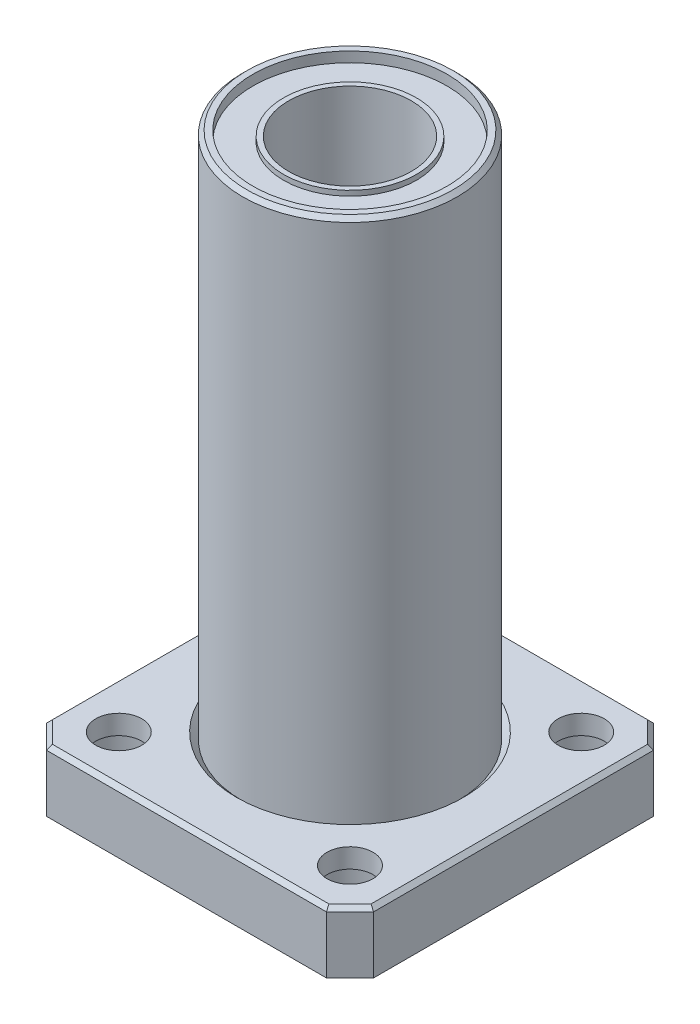
ISO-10303-21;
HEADER;
FILE_DESCRIPTION(('STEP AP214'),'2;1');
FILE_NAME('part.step','',(''),(''),'','','');
FILE_SCHEMA(('AUTOMOTIVE_DESIGN { 1 0 10303 214 1 1 1 1 }'));
ENDSEC;
DATA;
#1=APPLICATION_CONTEXT('core data for automotive mechanical design processes');
#2=APPLICATION_PROTOCOL_DEFINITION('international standard','automotive_design',2000,#1);
#3=PRODUCT_CONTEXT('',#1,'mechanical');
#4=PRODUCT('Part','Part','',(#3));
#5=PRODUCT_RELATED_PRODUCT_CATEGORY('part','',(#4));
#6=PRODUCT_DEFINITION_FORMATION('','',#4);
#7=PRODUCT_DEFINITION_CONTEXT('part definition',#1,'design');
#8=PRODUCT_DEFINITION('design','',#6,#7);
#9=PRODUCT_DEFINITION_SHAPE('','',#8);
#10=(LENGTH_UNIT() NAMED_UNIT(*) SI_UNIT(.MILLI.,.METRE.));
#11=(NAMED_UNIT(*) PLANE_ANGLE_UNIT() SI_UNIT($,.RADIAN.));
#12=(NAMED_UNIT(*) SI_UNIT($,.STERADIAN.) SOLID_ANGLE_UNIT());
#13=UNCERTAINTY_MEASURE_WITH_UNIT(LENGTH_MEASURE(1.E-05),#10,'distance_accuracy_value','');
#14=(GEOMETRIC_REPRESENTATION_CONTEXT(3) GLOBAL_UNCERTAINTY_ASSIGNED_CONTEXT((#13)) GLOBAL_UNIT_ASSIGNED_CONTEXT((#10,
#11,#12)) REPRESENTATION_CONTEXT('',''));
#15=CARTESIAN_POINT('',(0.,0.,0.));
#16=DIRECTION('',(0.,0.,1.));
#17=DIRECTION('',(1.,0.,0.));
#18=AXIS2_PLACEMENT_3D('',#15,#16,#17);
#19=CARTESIAN_POINT('',(11.3137084989848,4.1,-11.3137084989848));
#20=DIRECTION('',(0.,-1.,0.));
#21=DIRECTION('',(0.,0.,-1.));
#22=AXIS2_PLACEMENT_3D('',#19,#20,#21);
#23=CYLINDRICAL_SURFACE('',#22,3.75);
#24=CARTESIAN_POINT('',(11.3137084989848,0.,-11.3137084989848));
#25=DIRECTION('',(0.,-1.,0.));
#26=DIRECTION('',(0.,0.,-1.));
#27=AXIS2_PLACEMENT_3D('',#24,#25,#26);
#28=CIRCLE('',#27,3.75);
#29=CARTESIAN_POINT('',(11.3137084989848,0.,-15.0637084989848));
#30=VERTEX_POINT('',#29);
#31=EDGE_CURVE('P0_E19',#30,#30,#28,.T.);
#32=ORIENTED_EDGE('',*,*,#31,.T.);
#33=EDGE_LOOP('',(#32));
#34=FACE_BOUND('',#33,.T.);
#35=CARTESIAN_POINT('',(11.3137084989848,3.69999999998072,-11.3137084989848));
#36=DIRECTION('',(0.,-1.,0.));
#37=DIRECTION('',(0.,0.,1.));
#38=AXIS2_PLACEMENT_3D('',#35,#36,#37);
#39=CIRCLE('',#38,3.74999999993583);
#40=CARTESIAN_POINT('',(11.3137084989848,3.69999999998072,-7.56370849904897));
#41=VERTEX_POINT('',#40);
#42=EDGE_CURVE('P0_E133',#41,#41,#39,.F.);
#43=ORIENTED_EDGE('',*,*,#42,.T.);
#44=EDGE_LOOP('',(#43));
#45=FACE_BOUND('',#44,.T.);
#46=ADVANCED_FACE('P0_F16',(#34,#45),#23,.F.);
#47=CARTESIAN_POINT('',(0.,0.,0.));
#48=DIRECTION('',(0.,1.,0.));
#49=DIRECTION('',(0.,0.,1.));
#50=AXIS2_PLACEMENT_3D('',#47,#48,#49);
#51=PLANE('',#50);
#52=CARTESIAN_POINT('',(0.,0.,0.));
#53=DIRECTION('',(0.,-1.,0.));
#54=DIRECTION('',(0.,0.,-1.));
#55=AXIS2_PLACEMENT_3D('',#52,#53,#54);
#56=CIRCLE('',#55,10.9);
#57=CARTESIAN_POINT('',(0.,0.,-10.9));
#58=VERTEX_POINT('',#57);
#59=EDGE_CURVE('P0_E183',#58,#58,#56,.F.);
#60=ORIENTED_EDGE('',*,*,#59,.T.);
#61=EDGE_LOOP('',(#60));
#62=FACE_BOUND('',#61,.T.);
#63=CARTESIAN_POINT('',(-11.3137084989848,0.,-11.3137084989848));
#64=DIRECTION('',(0.,-1.,0.));
#65=DIRECTION('',(0.,0.,-1.));
#66=AXIS2_PLACEMENT_3D('',#63,#64,#65);
#67=CIRCLE('',#66,3.75);
#68=CARTESIAN_POINT('',(-11.3137084989848,0.,-15.0637084989848));
#69=VERTEX_POINT('',#68);
#70=EDGE_CURVE('P0_E181',#69,#69,#67,.F.);
#71=ORIENTED_EDGE('',*,*,#70,.T.);
#72=EDGE_LOOP('',(#71));
#73=FACE_BOUND('',#72,.T.);
#74=ORIENTED_EDGE('',*,*,#31,.F.);
#75=EDGE_LOOP('',(#74));
#76=FACE_BOUND('',#75,.T.);
#77=CARTESIAN_POINT('',(11.3137084989848,0.,11.3137084989848));
#78=DIRECTION('',(0.,-1.,0.));
#79=DIRECTION('',(0.,0.,-1.));
#80=AXIS2_PLACEMENT_3D('',#77,#78,#79);
#81=CIRCLE('',#80,3.75);
#82=CARTESIAN_POINT('',(11.3137084989848,0.,7.5637084989848));
#83=VERTEX_POINT('',#82);
#84=EDGE_CURVE('P0_E135',#83,#83,#81,.F.);
#85=ORIENTED_EDGE('',*,*,#84,.T.);
#86=EDGE_LOOP('',(#85));
#87=FACE_BOUND('',#86,.T.);
#88=CARTESIAN_POINT('',(-11.3137084989848,0.,11.3137084989848));
#89=DIRECTION('',(0.,-1.,0.));
#90=DIRECTION('',(0.,0.,-1.));
#91=AXIS2_PLACEMENT_3D('',#88,#89,#90);
#92=CIRCLE('',#91,3.75);
#93=CARTESIAN_POINT('',(-11.3137084989848,0.,7.5637084989848));
#94=VERTEX_POINT('',#93);
#95=EDGE_CURVE('P0_E121',#94,#94,#92,.F.);
#96=ORIENTED_EDGE('',*,*,#95,.T.);
#97=EDGE_LOOP('',(#96));
#98=FACE_BOUND('',#97,.T.);
#99=DIRECTION('',(-0.707106781186548,0.,0.707106781186548));
#100=VECTOR('',#99,1.);
#101=CARTESIAN_POINT('',(29.698484809835,0.,0.));
#102=LINE('',#101,#100);
#103=CARTESIAN_POINT('',(16.,0.,13.698484809835));
#104=VERTEX_POINT('',#103);
#105=CARTESIAN_POINT('',(13.698484809835,0.,16.));
#106=VERTEX_POINT('',#105);
#107=EDGE_CURVE('P0_E108',#104,#106,#102,.T.);
#108=ORIENTED_EDGE('',*,*,#107,.T.);
#109=DIRECTION('',(-1.,0.,0.));
#110=VECTOR('',#109,1.);
#111=CARTESIAN_POINT('',(-16.,0.,16.));
#112=LINE('',#111,#110);
#113=CARTESIAN_POINT('',(-13.698484809835,0.,16.));
#114=VERTEX_POINT('',#113);
#115=EDGE_CURVE('P0_E308',#106,#114,#112,.T.);
#116=ORIENTED_EDGE('',*,*,#115,.T.);
#117=DIRECTION('',(-0.707106781186547,0.,-0.707106781186548));
#118=VECTOR('',#117,1.);
#119=CARTESIAN_POINT('',(0.,0.,29.698484809835));
#120=LINE('',#119,#118);
#121=CARTESIAN_POINT('',(-16.,0.,13.698484809835));
#122=VERTEX_POINT('',#121);
#123=EDGE_CURVE('P0_E313',#114,#122,#120,.T.);
#124=ORIENTED_EDGE('',*,*,#123,.T.);
#125=DIRECTION('',(0.,0.,-1.));
#126=VECTOR('',#125,1.);
#127=CARTESIAN_POINT('',(-16.,0.,-16.));
#128=LINE('',#127,#126);
#129=CARTESIAN_POINT('',(-16.,0.,-13.698484809835));
#130=VERTEX_POINT('',#129);
#131=EDGE_CURVE('P0_E317',#122,#130,#128,.T.);
#132=ORIENTED_EDGE('',*,*,#131,.T.);
#133=DIRECTION('',(0.707106781186548,0.,-0.707106781186547));
#134=VECTOR('',#133,1.);
#135=CARTESIAN_POINT('',(0.,0.,-29.698484809835));
#136=LINE('',#135,#134);
#137=CARTESIAN_POINT('',(-13.698484809835,0.,-16.));
#138=VERTEX_POINT('',#137);
#139=EDGE_CURVE('P0_E321',#130,#138,#136,.T.);
#140=ORIENTED_EDGE('',*,*,#139,.T.);
#141=DIRECTION('',(1.,0.,0.));
#142=VECTOR('',#141,1.);
#143=CARTESIAN_POINT('',(-16.,0.,-16.));
#144=LINE('',#143,#142);
#145=CARTESIAN_POINT('',(13.698484809835,0.,-16.));
#146=VERTEX_POINT('',#145);
#147=EDGE_CURVE('P0_E324',#138,#146,#144,.T.);
#148=ORIENTED_EDGE('',*,*,#147,.T.);
#149=DIRECTION('',(0.707106781186547,0.,0.707106781186548));
#150=VECTOR('',#149,1.);
#151=CARTESIAN_POINT('',(29.698484809835,0.,0.));
#152=LINE('',#151,#150);
#153=CARTESIAN_POINT('',(16.,0.,-13.698484809835));
#154=VERTEX_POINT('',#153);
#155=EDGE_CURVE('P0_E103',#146,#154,#152,.T.);
#156=ORIENTED_EDGE('',*,*,#155,.T.);
#157=DIRECTION('',(0.,0.,1.));
#158=VECTOR('',#157,1.);
#159=CARTESIAN_POINT('',(16.,0.,-16.));
#160=LINE('',#159,#158);
#161=EDGE_CURVE('P0_E105',#154,#104,#160,.T.);
#162=ORIENTED_EDGE('',*,*,#161,.T.);
#163=EDGE_LOOP('',(#108,#116,#124,#132,#140,#148,#156,#162));
#164=FACE_BOUND('',#163,.T.);
#165=ADVANCED_FACE('P0_F107',(#62,#73,#76,#87,#98,#164),#51,.F.);
#166=CARTESIAN_POINT('',(0.,0.,0.));
#167=DIRECTION('',(0.,-1.,0.));
#168=DIRECTION('',(0.,0.,-1.));
#169=AXIS2_PLACEMENT_3D('',#166,#167,#168);
#170=CONICAL_SURFACE('',#169,10.9,0.785398163397449);
#171=CARTESIAN_POINT('',(0.,0.399999999999998,0.));
#172=DIRECTION('',(0.,-1.,0.));
#173=DIRECTION('',(0.,0.,-1.));
#174=AXIS2_PLACEMENT_3D('',#171,#172,#173);
#175=CIRCLE('',#174,10.5);
#176=CARTESIAN_POINT('',(0.,0.399999999999998,-10.5));
#177=VERTEX_POINT('',#176);
#178=EDGE_CURVE('P0_E176',#177,#177,#175,.F.);
#179=ORIENTED_EDGE('',*,*,#178,.T.);
#180=EDGE_LOOP('',(#179));
#181=FACE_BOUND('',#180,.T.);
#182=ORIENTED_EDGE('',*,*,#59,.F.);
#183=EDGE_LOOP('',(#182));
#184=FACE_BOUND('',#183,.T.);
#185=ADVANCED_FACE('P0_F194',(#181,#184),#170,.F.);
#186=CARTESIAN_POINT('',(-11.3137084989848,4.1,-11.3137084989848));
#187=DIRECTION('',(0.,-1.,0.));
#188=DIRECTION('',(0.,0.,-1.));
#189=AXIS2_PLACEMENT_3D('',#186,#187,#188);
#190=CYLINDRICAL_SURFACE('',#189,3.75);
#191=ORIENTED_EDGE('',*,*,#70,.F.);
#192=EDGE_LOOP('',(#191));
#193=FACE_BOUND('',#192,.T.);
#194=CARTESIAN_POINT('',(-11.3137084989848,4.1,-11.3137084989848));
#195=DIRECTION('',(0.,-1.,0.));
#196=DIRECTION('',(0.,0.,-1.));
#197=AXIS2_PLACEMENT_3D('',#194,#195,#196);
#198=CIRCLE('',#197,3.75);
#199=CARTESIAN_POINT('',(-11.3137084989848,4.1,-15.0637084989848));
#200=VERTEX_POINT('',#199);
#201=EDGE_CURVE('P0_E173',#200,#200,#198,.T.);
#202=ORIENTED_EDGE('',*,*,#201,.F.);
#203=EDGE_LOOP('',(#202));
#204=FACE_BOUND('',#203,.T.);
#205=ADVANCED_FACE('P0_F421',(#193,#204),#190,.F.);
#206=CARTESIAN_POINT('',(11.3137084989848,4.1,11.3137084989848));
#207=DIRECTION('',(0.,-1.,0.));
#208=DIRECTION('',(0.,0.,-1.));
#209=AXIS2_PLACEMENT_3D('',#206,#207,#208);
#210=CYLINDRICAL_SURFACE('',#209,3.75);
#211=ORIENTED_EDGE('',*,*,#84,.F.);
#212=EDGE_LOOP('',(#211));
#213=FACE_BOUND('',#212,.T.);
#214=CARTESIAN_POINT('',(11.3137084989848,4.1,11.3137084989848));
#215=DIRECTION('',(0.,-1.,0.));
#216=DIRECTION('',(0.,0.,-1.));
#217=AXIS2_PLACEMENT_3D('',#214,#215,#216);
#218=CIRCLE('',#217,3.75);
#219=CARTESIAN_POINT('',(11.3137084989848,4.1,7.5637084989848));
#220=VERTEX_POINT('',#219);
#221=EDGE_CURVE('P0_E170',#220,#220,#218,.T.);
#222=ORIENTED_EDGE('',*,*,#221,.F.);
#223=EDGE_LOOP('',(#222));
#224=FACE_BOUND('',#223,.T.);
#225=ADVANCED_FACE('P0_F417',(#213,#224),#210,.F.);
#226=CARTESIAN_POINT('',(11.3137084989848,3.70000000003756,-11.3137084989848));
#227=DIRECTION('',(0.,-1.,0.));
#228=DIRECTION('',(0.,0.,-1.));
#229=AXIS2_PLACEMENT_3D('',#226,#227,#228);
#230=CONICAL_SURFACE('',#229,3.74999999987899,0.785398163397448);
#231=ORIENTED_EDGE('',*,*,#42,.F.);
#232=EDGE_LOOP('',(#231));
#233=FACE_BOUND('',#232,.T.);
#234=CARTESIAN_POINT('',(11.3137084989848,4.099999999994,-11.3137084989848));
#235=DIRECTION('',(0.,-1.,0.));
#236=DIRECTION('',(0.,0.,-1.));
#237=AXIS2_PLACEMENT_3D('',#234,#235,#236);
#238=CIRCLE('',#237,3.34999999992255);
#239=CARTESIAN_POINT('',(11.3137084989848,4.099999999994,-14.6637084989074));
#240=VERTEX_POINT('',#239);
#241=EDGE_CURVE('P0_E167',#240,#240,#238,.T.);
#242=ORIENTED_EDGE('',*,*,#241,.F.);
#243=EDGE_LOOP('',(#242));
#244=FACE_BOUND('',#243,.T.);
#245=ADVANCED_FACE('P0_F202',(#233,#244),#230,.F.);
#246=CARTESIAN_POINT('',(-11.3137084989848,4.1,11.3137084989848));
#247=DIRECTION('',(0.,-1.,0.));
#248=DIRECTION('',(0.,0.,-1.));
#249=AXIS2_PLACEMENT_3D('',#246,#247,#248);
#250=CYLINDRICAL_SURFACE('',#249,3.75);
#251=ORIENTED_EDGE('',*,*,#95,.F.);
#252=EDGE_LOOP('',(#251));
#253=FACE_BOUND('',#252,.T.);
#254=CARTESIAN_POINT('',(-11.3137084989848,4.1,11.3137084989848));
#255=DIRECTION('',(0.,-1.,0.));
#256=DIRECTION('',(0.,0.,-1.));
#257=AXIS2_PLACEMENT_3D('',#254,#255,#256);
#258=CIRCLE('',#257,3.75);
#259=CARTESIAN_POINT('',(-11.3137084989848,4.1,7.5637084989848));
#260=VERTEX_POINT('',#259);
#261=EDGE_CURVE('P0_E163',#260,#260,#258,.T.);
#262=ORIENTED_EDGE('',*,*,#261,.F.);
#263=EDGE_LOOP('',(#262));
#264=FACE_BOUND('',#263,.T.);
#265=ADVANCED_FACE('P0_F199',(#253,#264),#250,.F.);
#266=CARTESIAN_POINT('',(29.698484809835,57.,0.));
#267=DIRECTION('',(-0.707106781186548,0.,-0.707106781186548));
#268=DIRECTION('',(-0.707106781186548,0.,0.707106781186548));
#269=AXIS2_PLACEMENT_3D('',#266,#267,#268);
#270=PLANE('',#269);
#271=DIRECTION('',(0.,1.,0.));
#272=VECTOR('',#271,1.);
#273=CARTESIAN_POINT('',(13.698484809835,6.,16.));
#274=LINE('',#273,#272);
#275=CARTESIAN_POINT('',(13.698484809835,5.59999999999998,16.));
#276=VERTEX_POINT('',#275);
#277=EDGE_CURVE('P0_E119',#276,#106,#274,.F.);
#278=ORIENTED_EDGE('',*,*,#277,.T.);
#279=ORIENTED_EDGE('',*,*,#107,.F.);
#280=DIRECTION('',(0.,1.,0.));
#281=VECTOR('',#280,1.);
#282=CARTESIAN_POINT('',(16.,6.,13.698484809835));
#283=LINE('',#282,#281);
#284=CARTESIAN_POINT('',(16.,5.59999999999998,13.698484809835));
#285=VERTEX_POINT('',#284);
#286=EDGE_CURVE('P0_E113',#104,#285,#283,.T.);
#287=ORIENTED_EDGE('',*,*,#286,.T.);
#288=DIRECTION('',(0.707106781186548,0.,-0.707106781186548));
#289=VECTOR('',#288,1.);
#290=CARTESIAN_POINT('',(13.698484809835,5.59999999999999,16.));
#291=LINE('',#290,#289);
#292=EDGE_CURVE('P0_E166',#276,#285,#291,.T.);
#293=ORIENTED_EDGE('',*,*,#292,.F.);
#294=EDGE_LOOP('',(#278,#279,#287,#293));
#295=FACE_BOUND('',#294,.T.);
#296=ADVANCED_FACE('P0_F116',(#295),#270,.F.);
#297=CARTESIAN_POINT('',(16.,6.,-16.));
#298=DIRECTION('',(-1.,0.,0.));
#299=DIRECTION('',(0.,0.,1.));
#300=AXIS2_PLACEMENT_3D('',#297,#298,#299);
#301=PLANE('',#300);
#302=ORIENTED_EDGE('',*,*,#286,.F.);
#303=ORIENTED_EDGE('',*,*,#161,.F.);
#304=DIRECTION('',(0.,1.,0.));
#305=VECTOR('',#304,1.);
#306=CARTESIAN_POINT('',(16.,57.,-13.698484809835));
#307=LINE('',#306,#305);
#308=CARTESIAN_POINT('',(16.,5.6,-13.698484809835));
#309=VERTEX_POINT('',#308);
#310=EDGE_CURVE('P0_E129',#154,#309,#307,.T.);
#311=ORIENTED_EDGE('',*,*,#310,.T.);
#312=DIRECTION('',(0.,0.,1.));
#313=VECTOR('',#312,1.);
#314=CARTESIAN_POINT('',(16.,5.6,-8.));
#315=LINE('',#314,#313);
#316=EDGE_CURVE('P0_E126',#285,#309,#315,.F.);
#317=ORIENTED_EDGE('',*,*,#316,.F.);
#318=EDGE_LOOP('',(#302,#303,#311,#317));
#319=FACE_BOUND('',#318,.T.);
#320=ADVANCED_FACE('P0_F124',(#319),#301,.F.);
#321=CARTESIAN_POINT('',(29.698484809835,57.,0.));
#322=DIRECTION('',(-0.707106781186548,0.,0.707106781186547));
#323=DIRECTION('',(0.707106781186547,0.,0.707106781186548));
#324=AXIS2_PLACEMENT_3D('',#321,#322,#323);
#325=PLANE('',#324);
#326=ORIENTED_EDGE('',*,*,#310,.F.);
#327=ORIENTED_EDGE('',*,*,#155,.F.);
#328=DIRECTION('',(0.,1.,0.));
#329=VECTOR('',#328,1.);
#330=CARTESIAN_POINT('',(13.698484809835,6.,-16.));
#331=LINE('',#330,#329);
#332=CARTESIAN_POINT('',(13.698484809835,5.6,-16.));
#333=VERTEX_POINT('',#332);
#334=EDGE_CURVE('P0_E290',#146,#333,#331,.T.);
#335=ORIENTED_EDGE('',*,*,#334,.T.);
#336=DIRECTION('',(-0.707106781186548,0.,-0.707106781186547));
#337=VECTOR('',#336,1.);
#338=CARTESIAN_POINT('',(16.,5.59999999999998,-13.698484809835));
#339=LINE('',#338,#337);
#340=EDGE_CURVE('P0_E287',#309,#333,#339,.T.);
#341=ORIENTED_EDGE('',*,*,#340,.F.);
#342=EDGE_LOOP('',(#326,#327,#335,#341));
#343=FACE_BOUND('',#342,.T.);
#344=ADVANCED_FACE('P0_F288',(#343),#325,.F.);
#345=CARTESIAN_POINT('',(-16.,6.,-16.));
#346=DIRECTION('',(0.,0.,1.));
#347=DIRECTION('',(1.,0.,0.));
#348=AXIS2_PLACEMENT_3D('',#345,#346,#347);
#349=PLANE('',#348);
#350=ORIENTED_EDGE('',*,*,#334,.F.);
#351=ORIENTED_EDGE('',*,*,#147,.F.);
#352=DIRECTION('',(0.,1.,0.));
#353=VECTOR('',#352,1.);
#354=CARTESIAN_POINT('',(-13.698484809835,57.,-16.));
#355=LINE('',#354,#353);
#356=CARTESIAN_POINT('',(-13.698484809835,5.6,-16.));
#357=VERTEX_POINT('',#356);
#358=EDGE_CURVE('P0_E319',#138,#357,#355,.T.);
#359=ORIENTED_EDGE('',*,*,#358,.T.);
#360=DIRECTION('',(1.,0.,0.));
#361=VECTOR('',#360,1.);
#362=CARTESIAN_POINT('',(-8.,5.6,-16.));
#363=LINE('',#362,#361);
#364=EDGE_CURVE('P0_E331',#333,#357,#363,.F.);
#365=ORIENTED_EDGE('',*,*,#364,.F.);
#366=EDGE_LOOP('',(#350,#351,#359,#365));
#367=FACE_BOUND('',#366,.T.);
#368=ADVANCED_FACE('P0_F329',(#367),#349,.F.);
#369=CARTESIAN_POINT('',(0.,57.,-29.698484809835));
#370=DIRECTION('',(0.707106781186547,0.,0.707106781186548));
#371=DIRECTION('',(0.707106781186548,0.,-0.707106781186547));
#372=AXIS2_PLACEMENT_3D('',#369,#370,#371);
#373=PLANE('',#372);
#374=ORIENTED_EDGE('',*,*,#358,.F.);
#375=ORIENTED_EDGE('',*,*,#139,.F.);
#376=DIRECTION('',(0.,1.,0.));
#377=VECTOR('',#376,1.);
#378=CARTESIAN_POINT('',(-16.,6.,-13.698484809835));
#379=LINE('',#378,#377);
#380=CARTESIAN_POINT('',(-16.,5.6,-13.698484809835));
#381=VERTEX_POINT('',#380);
#382=EDGE_CURVE('P0_E315',#130,#381,#379,.T.);
#383=ORIENTED_EDGE('',*,*,#382,.T.);
#384=DIRECTION('',(-0.707106781186548,0.,0.707106781186547));
#385=VECTOR('',#384,1.);
#386=CARTESIAN_POINT('',(-13.698484809835,5.59999999999998,-16.));
#387=LINE('',#386,#385);
#388=EDGE_CURVE('P0_E342',#357,#381,#387,.T.);
#389=ORIENTED_EDGE('',*,*,#388,.F.);
#390=EDGE_LOOP('',(#374,#375,#383,#389));
#391=FACE_BOUND('',#390,.T.);
#392=ADVANCED_FACE('P0_F398',(#391),#373,.F.);
#393=CARTESIAN_POINT('',(-16.,6.,-16.));
#394=DIRECTION('',(1.,0.,0.));
#395=DIRECTION('',(0.,0.,-1.));
#396=AXIS2_PLACEMENT_3D('',#393,#394,#395);
#397=PLANE('',#396);
#398=ORIENTED_EDGE('',*,*,#382,.F.);
#399=ORIENTED_EDGE('',*,*,#131,.F.);
#400=DIRECTION('',(0.,1.,0.));
#401=VECTOR('',#400,1.);
#402=CARTESIAN_POINT('',(-16.,57.,13.698484809835));
#403=LINE('',#402,#401);
#404=CARTESIAN_POINT('',(-16.,5.6,13.698484809835));
#405=VERTEX_POINT('',#404);
#406=EDGE_CURVE('P0_E311',#122,#405,#403,.T.);
#407=ORIENTED_EDGE('',*,*,#406,.T.);
#408=DIRECTION('',(0.,0.,1.));
#409=VECTOR('',#408,1.);
#410=CARTESIAN_POINT('',(-16.,5.6,-8.));
#411=LINE('',#410,#409);
#412=EDGE_CURVE('P0_E348',#381,#405,#411,.T.);
#413=ORIENTED_EDGE('',*,*,#412,.F.);
#414=EDGE_LOOP('',(#398,#399,#407,#413));
#415=FACE_BOUND('',#414,.T.);
#416=ADVANCED_FACE('P0_F396',(#415),#397,.F.);
#417=CARTESIAN_POINT('',(0.,57.,29.698484809835));
#418=DIRECTION('',(0.707106781186548,0.,-0.707106781186547));
#419=DIRECTION('',(-0.707106781186547,0.,-0.707106781186548));
#420=AXIS2_PLACEMENT_3D('',#417,#418,#419);
#421=PLANE('',#420);
#422=ORIENTED_EDGE('',*,*,#406,.F.);
#423=ORIENTED_EDGE('',*,*,#123,.F.);
#424=DIRECTION('',(0.,1.,0.));
#425=VECTOR('',#424,1.);
#426=CARTESIAN_POINT('',(-13.698484809835,6.,16.));
#427=LINE('',#426,#425);
#428=CARTESIAN_POINT('',(-13.698484809835,5.6,16.));
#429=VERTEX_POINT('',#428);
#430=EDGE_CURVE('P0_E304',#114,#429,#427,.T.);
#431=ORIENTED_EDGE('',*,*,#430,.T.);
#432=DIRECTION('',(0.707106781186548,0.,0.707106781186548));
#433=VECTOR('',#432,1.);
#434=CARTESIAN_POINT('',(-16.,5.59999999999999,13.698484809835));
#435=LINE('',#434,#433);
#436=EDGE_CURVE('P0_E351',#405,#429,#435,.T.);
#437=ORIENTED_EDGE('',*,*,#436,.F.);
#438=EDGE_LOOP('',(#422,#423,#431,#437));
#439=FACE_BOUND('',#438,.T.);
#440=ADVANCED_FACE('P0_F388',(#439),#421,.F.);
#441=CARTESIAN_POINT('',(-16.,6.,16.));
#442=DIRECTION('',(0.,0.,-1.));
#443=DIRECTION('',(-1.,0.,0.));
#444=AXIS2_PLACEMENT_3D('',#441,#442,#443);
#445=PLANE('',#444);
#446=ORIENTED_EDGE('',*,*,#430,.F.);
#447=ORIENTED_EDGE('',*,*,#115,.F.);
#448=ORIENTED_EDGE('',*,*,#277,.F.);
#449=DIRECTION('',(1.,0.,0.));
#450=VECTOR('',#449,1.);
#451=CARTESIAN_POINT('',(-8.,5.6,16.));
#452=LINE('',#451,#450);
#453=EDGE_CURVE('P0_E356',#429,#276,#452,.T.);
#454=ORIENTED_EDGE('',*,*,#453,.F.);
#455=EDGE_LOOP('',(#446,#447,#448,#454));
#456=FACE_BOUND('',#455,.T.);
#457=ADVANCED_FACE('P0_F392',(#456),#445,.F.);
#458=CARTESIAN_POINT('',(0.,57.,0.));
#459=DIRECTION('',(0.,-1.,0.));
#460=DIRECTION('',(0.,0.,-1.));
#461=AXIS2_PLACEMENT_3D('',#458,#459,#460);
#462=CYLINDRICAL_SURFACE('',#461,10.5);
#463=ORIENTED_EDGE('',*,*,#178,.F.);
#464=EDGE_LOOP('',(#463));
#465=FACE_BOUND('',#464,.T.);
#466=CARTESIAN_POINT('',(0.,5.4,0.));
#467=DIRECTION('',(0.,1.,0.));
#468=DIRECTION('',(0.,0.,1.));
#469=AXIS2_PLACEMENT_3D('',#466,#467,#468);
#470=CIRCLE('',#469,10.5);
#471=CARTESIAN_POINT('',(0.,5.4,10.5));
#472=VERTEX_POINT('',#471);
#473=EDGE_CURVE('P0_E162',#472,#472,#470,.T.);
#474=ORIENTED_EDGE('',*,*,#473,.T.);
#475=EDGE_LOOP('',(#474));
#476=FACE_BOUND('',#475,.T.);
#477=ADVANCED_FACE('P0_F433',(#465,#476),#462,.F.);
#478=CARTESIAN_POINT('',(-11.3137084989848,4.1,-11.3137084989848));
#479=DIRECTION('',(0.,-1.,0.));
#480=DIRECTION('',(0.,0.,-1.));
#481=AXIS2_PLACEMENT_3D('',#478,#479,#480);
#482=PLANE('',#481);
#483=CARTESIAN_POINT('',(-11.3137084989848,4.1,-11.3137084989848));
#484=DIRECTION('',(0.,-1.,0.));
#485=DIRECTION('',(0.,0.,-1.));
#486=AXIS2_PLACEMENT_3D('',#483,#484,#485);
#487=CIRCLE('',#486,2.25);
#488=CARTESIAN_POINT('',(-11.3137084989848,4.1,-13.5637084989848));
#489=VERTEX_POINT('',#488);
#490=EDGE_CURVE('P0_E159',#489,#489,#487,.F.);
#491=ORIENTED_EDGE('',*,*,#490,.T.);
#492=EDGE_LOOP('',(#491));
#493=FACE_BOUND('',#492,.T.);
#494=ORIENTED_EDGE('',*,*,#201,.T.);
#495=EDGE_LOOP('',(#494));
#496=FACE_BOUND('',#495,.T.);
#497=ADVANCED_FACE('P0_F436',(#493,#496),#482,.T.);
#498=CARTESIAN_POINT('',(11.3137084989848,4.1,11.3137084989848));
#499=DIRECTION('',(0.,-1.,0.));
#500=DIRECTION('',(0.,0.,-1.));
#501=AXIS2_PLACEMENT_3D('',#498,#499,#500);
#502=PLANE('',#501);
#503=CARTESIAN_POINT('',(11.3137084989848,4.1,11.3137084989848));
#504=DIRECTION('',(0.,-1.,0.));
#505=DIRECTION('',(0.,0.,-1.));
#506=AXIS2_PLACEMENT_3D('',#503,#504,#505);
#507=CIRCLE('',#506,2.25);
#508=CARTESIAN_POINT('',(11.3137084989848,4.1,9.0637084989848));
#509=VERTEX_POINT('',#508);
#510=EDGE_CURVE('P0_E156',#509,#509,#507,.F.);
#511=ORIENTED_EDGE('',*,*,#510,.T.);
#512=EDGE_LOOP('',(#511));
#513=FACE_BOUND('',#512,.T.);
#514=ORIENTED_EDGE('',*,*,#221,.T.);
#515=EDGE_LOOP('',(#514));
#516=FACE_BOUND('',#515,.T.);
#517=ADVANCED_FACE('P0_F220',(#513,#516),#502,.T.);
#518=CARTESIAN_POINT('',(11.3137084989848,4.1,-11.3137084989848));
#519=DIRECTION('',(0.,-1.,0.));
#520=DIRECTION('',(0.,0.,-1.));
#521=AXIS2_PLACEMENT_3D('',#518,#519,#520);
#522=PLANE('',#521);
#523=CARTESIAN_POINT('',(11.3137084989848,4.1,-11.3137084989848));
#524=DIRECTION('',(0.,-1.,0.));
#525=DIRECTION('',(0.,0.,-1.));
#526=AXIS2_PLACEMENT_3D('',#523,#524,#525);
#527=CIRCLE('',#526,2.25);
#528=CARTESIAN_POINT('',(11.3137084989848,4.1,-13.5637084989848));
#529=VERTEX_POINT('',#528);
#530=EDGE_CURVE('P0_E153',#529,#529,#527,.F.);
#531=ORIENTED_EDGE('',*,*,#530,.T.);
#532=EDGE_LOOP('',(#531));
#533=FACE_BOUND('',#532,.T.);
#534=ORIENTED_EDGE('',*,*,#241,.T.);
#535=EDGE_LOOP('',(#534));
#536=FACE_BOUND('',#535,.T.);
#537=ADVANCED_FACE('P0_F209',(#533,#536),#522,.T.);
#538=CARTESIAN_POINT('',(-11.3137084989848,4.1,11.3137084989848));
#539=DIRECTION('',(0.,-1.,0.));
#540=DIRECTION('',(0.,0.,-1.));
#541=AXIS2_PLACEMENT_3D('',#538,#539,#540);
#542=PLANE('',#541);
#543=CARTESIAN_POINT('',(-11.3137084989848,4.1,11.3137084989848));
#544=DIRECTION('',(0.,-1.,0.));
#545=DIRECTION('',(0.,0.,-1.));
#546=AXIS2_PLACEMENT_3D('',#543,#544,#545);
#547=CIRCLE('',#546,2.25);
#548=CARTESIAN_POINT('',(-11.3137084989848,4.1,9.0637084989848));
#549=VERTEX_POINT('',#548);
#550=EDGE_CURVE('P0_E149',#549,#549,#547,.F.);
#551=ORIENTED_EDGE('',*,*,#550,.T.);
#552=EDGE_LOOP('',(#551));
#553=FACE_BOUND('',#552,.T.);
#554=ORIENTED_EDGE('',*,*,#261,.T.);
#555=EDGE_LOOP('',(#554));
#556=FACE_BOUND('',#555,.T.);
#557=ADVANCED_FACE('P0_F206',(#553,#556),#542,.T.);
#558=CARTESIAN_POINT('',(22.1324422511389,5.8,7.28319984622145));
#559=DIRECTION('',(0.500000000000003,0.707106781186544,0.500000000000003));
#560=DIRECTION('',(0.,-0.57735026918963,0.816496580927723));
#561=AXIS2_PLACEMENT_3D('',#558,#559,#560);
#562=PLANE('',#561);
#563=DIRECTION('',(0.707106781186547,0.,-0.707106781186547));
#564=VECTOR('',#563,1.);
#565=CARTESIAN_POINT('',(13.5327993848858,6.,15.6));
#566=LINE('',#565,#564);
#567=CARTESIAN_POINT('',(13.5327993848858,5.99999999999999,15.6));
#568=VERTEX_POINT('',#567);
#569=CARTESIAN_POINT('',(15.6,5.99999999999999,13.5327993848858));
#570=VERTEX_POINT('',#569);
#571=EDGE_CURVE('P0_E152',#568,#570,#566,.T.);
#572=ORIENTED_EDGE('',*,*,#571,.F.);
#573=DIRECTION('',(-0.281084637714759,0.67859834454586,-0.678598344545859));
#574=VECTOR('',#573,1.);
#575=CARTESIAN_POINT('',(13.698484809835,5.6,16.));
#576=LINE('',#575,#574);
#577=EDGE_CURVE('P0_E359',#276,#568,#576,.T.);
#578=ORIENTED_EDGE('',*,*,#577,.F.);
#579=ORIENTED_EDGE('',*,*,#292,.T.);
#580=DIRECTION('',(0.678598344545861,-0.678598344545858,0.281084637714759));
#581=VECTOR('',#580,1.);
#582=CARTESIAN_POINT('',(15.6,6.,13.5327993848858));
#583=LINE('',#582,#581);
#584=EDGE_CURVE('P0_E283',#570,#285,#583,.T.);
#585=ORIENTED_EDGE('',*,*,#584,.F.);
#586=EDGE_LOOP('',(#572,#578,#579,#585));
#587=FACE_BOUND('',#586,.T.);
#588=ADVANCED_FACE('P0_F208',(#587),#562,.T.);
#589=CARTESIAN_POINT('',(15.8,5.8,-8.));
#590=DIRECTION('',(0.707106781186548,0.707106781186548,0.));
#591=DIRECTION('',(-0.707106781186548,0.707106781186548,0.));
#592=AXIS2_PLACEMENT_3D('',#589,#590,#591);
#593=PLANE('',#592);
#594=ORIENTED_EDGE('',*,*,#316,.T.);
#595=DIRECTION('',(0.678598344545876,-0.678598344545838,-0.281084637714774));
#596=VECTOR('',#595,1.);
#597=CARTESIAN_POINT('',(15.6,5.99999999999997,-13.5327993848858));
#598=LINE('',#597,#596);
#599=CARTESIAN_POINT('',(15.6,5.99999999999999,-13.5327993848858));
#600=VERTEX_POINT('',#599);
#601=EDGE_CURVE('P0_E281',#600,#309,#598,.T.);
#602=ORIENTED_EDGE('',*,*,#601,.F.);
#603=DIRECTION('',(0.,0.,1.));
#604=VECTOR('',#603,1.);
#605=CARTESIAN_POINT('',(15.6,6.,0.));
#606=LINE('',#605,#604);
#607=EDGE_CURVE('P0_E365',#570,#600,#606,.F.);
#608=ORIENTED_EDGE('',*,*,#607,.F.);
#609=ORIENTED_EDGE('',*,*,#584,.T.);
#610=EDGE_LOOP('',(#594,#602,#608,#609));
#611=FACE_BOUND('',#610,.T.);
#612=ADVANCED_FACE('P0_F217',(#611),#593,.T.);
#613=CARTESIAN_POINT('',(22.1324422511389,5.8,-7.28319984622143));
#614=DIRECTION('',(0.500000000000002,0.707106781186545,-0.500000000000002));
#615=DIRECTION('',(0.,0.577350269189629,0.816496580927724));
#616=AXIS2_PLACEMENT_3D('',#613,#614,#615);
#617=PLANE('',#616);
#618=ORIENTED_EDGE('',*,*,#340,.T.);
#619=DIRECTION('',(0.281084637714759,-0.67859834454586,-0.678598344545859));
#620=VECTOR('',#619,1.);
#621=CARTESIAN_POINT('',(13.5327993848858,6.,-15.6));
#622=LINE('',#621,#620);
#623=CARTESIAN_POINT('',(13.5327993848858,5.99999999999999,-15.6));
#624=VERTEX_POINT('',#623);
#625=EDGE_CURVE('P0_E292',#624,#333,#622,.T.);
#626=ORIENTED_EDGE('',*,*,#625,.F.);
#627=DIRECTION('',(-0.707106781186547,0.,-0.707106781186547));
#628=VECTOR('',#627,1.);
#629=CARTESIAN_POINT('',(15.6,6.,-13.5327993848858));
#630=LINE('',#629,#628);
#631=EDGE_CURVE('P0_E295',#600,#624,#630,.T.);
#632=ORIENTED_EDGE('',*,*,#631,.F.);
#633=ORIENTED_EDGE('',*,*,#601,.T.);
#634=EDGE_LOOP('',(#618,#626,#632,#633));
#635=FACE_BOUND('',#634,.T.);
#636=ADVANCED_FACE('P0_F269',(#635),#617,.T.);
#637=CARTESIAN_POINT('',(-8.,5.8,-15.8));
#638=DIRECTION('',(0.,0.707106781186548,-0.707106781186548));
#639=DIRECTION('',(0.,0.707106781186548,0.707106781186548));
#640=AXIS2_PLACEMENT_3D('',#637,#638,#639);
#641=PLANE('',#640);
#642=ORIENTED_EDGE('',*,*,#364,.T.);
#643=DIRECTION('',(-0.281084637714776,-0.678598344545841,-0.678598344545872));
#644=VECTOR('',#643,1.);
#645=CARTESIAN_POINT('',(-13.5327993848858,5.99999999999997,-15.6));
#646=LINE('',#645,#644);
#647=CARTESIAN_POINT('',(-13.5327993848858,5.99999999999999,-15.6));
#648=VERTEX_POINT('',#647);
#649=EDGE_CURVE('P0_E334',#648,#357,#646,.T.);
#650=ORIENTED_EDGE('',*,*,#649,.F.);
#651=DIRECTION('',(1.,0.,0.));
#652=VECTOR('',#651,1.);
#653=CARTESIAN_POINT('',(0.,6.,-15.6));
#654=LINE('',#653,#652);
#655=EDGE_CURVE('P0_E338',#624,#648,#654,.F.);
#656=ORIENTED_EDGE('',*,*,#655,.F.);
#657=ORIENTED_EDGE('',*,*,#625,.T.);
#658=EDGE_LOOP('',(#642,#650,#656,#657));
#659=FACE_BOUND('',#658,.T.);
#660=ADVANCED_FACE('P0_F265',(#659),#641,.T.);
#661=CARTESIAN_POINT('',(-7.28319984622143,5.8,-22.1324422511389));
#662=DIRECTION('',(-0.500000000000003,0.707106781186543,-0.500000000000003));
#663=DIRECTION('',(0.,0.577350269189631,0.816496580927723));
#664=AXIS2_PLACEMENT_3D('',#661,#662,#663);
#665=PLANE('',#664);
#666=ORIENTED_EDGE('',*,*,#388,.T.);
#667=DIRECTION('',(-0.678598344545859,-0.67859834454586,-0.281084637714759));
#668=VECTOR('',#667,1.);
#669=CARTESIAN_POINT('',(-15.6,6.,-13.5327993848858));
#670=LINE('',#669,#668);
#671=CARTESIAN_POINT('',(-15.6,5.99999999999999,-13.5327993848858));
#672=VERTEX_POINT('',#671);
#673=EDGE_CURVE('P0_E345',#672,#381,#670,.T.);
#674=ORIENTED_EDGE('',*,*,#673,.F.);
#675=DIRECTION('',(-0.707106781186547,0.,0.707106781186547));
#676=VECTOR('',#675,1.);
#677=CARTESIAN_POINT('',(-13.5327993848858,6.,-15.6));
#678=LINE('',#677,#676);
#679=EDGE_CURVE('P0_E369',#648,#672,#678,.T.);
#680=ORIENTED_EDGE('',*,*,#679,.F.);
#681=ORIENTED_EDGE('',*,*,#649,.T.);
#682=EDGE_LOOP('',(#666,#674,#680,#681));
#683=FACE_BOUND('',#682,.T.);
#684=ADVANCED_FACE('P0_F261',(#683),#665,.T.);
#685=CARTESIAN_POINT('',(-15.8,5.8,-8.));
#686=DIRECTION('',(-0.707106781186548,0.707106781186548,0.));
#687=DIRECTION('',(-0.707106781186548,-0.707106781186548,0.));
#688=AXIS2_PLACEMENT_3D('',#685,#686,#687);
#689=PLANE('',#688);
#690=ORIENTED_EDGE('',*,*,#412,.T.);
#691=DIRECTION('',(-0.678598344545872,-0.678598344545843,0.281084637714772));
#692=VECTOR('',#691,1.);
#693=CARTESIAN_POINT('',(-15.6,5.99999999999998,13.5327993848858));
#694=LINE('',#693,#692);
#695=CARTESIAN_POINT('',(-15.6,5.99999999999999,13.5327993848858));
#696=VERTEX_POINT('',#695);
#697=EDGE_CURVE('P0_E353',#696,#405,#694,.T.);
#698=ORIENTED_EDGE('',*,*,#697,.F.);
#699=DIRECTION('',(0.,0.,1.));
#700=VECTOR('',#699,1.);
#701=CARTESIAN_POINT('',(-15.6,6.,0.));
#702=LINE('',#701,#700);
#703=EDGE_CURVE('P0_E372',#672,#696,#702,.T.);
#704=ORIENTED_EDGE('',*,*,#703,.F.);
#705=ORIENTED_EDGE('',*,*,#673,.T.);
#706=EDGE_LOOP('',(#690,#698,#704,#705));
#707=FACE_BOUND('',#706,.T.);
#708=ADVANCED_FACE('P0_F258',(#707),#689,.T.);
#709=CARTESIAN_POINT('',(-7.28319984622144,5.8,22.1324422511389));
#710=DIRECTION('',(-0.500000000000005,0.707106781186541,0.500000000000005));
#711=DIRECTION('',(0.,-0.577350269189633,0.816496580927721));
#712=AXIS2_PLACEMENT_3D('',#709,#710,#711);
#713=PLANE('',#712);
#714=DIRECTION('',(0.707106781186565,0.,0.70710678118653));
#715=VECTOR('',#714,1.);
#716=CARTESIAN_POINT('',(-15.6,6.,13.5327993848858));
#717=LINE('',#716,#715);
#718=CARTESIAN_POINT('',(-13.5327993848857,6.00000000000001,15.6));
#719=VERTEX_POINT('',#718);
#720=EDGE_CURVE('P0_E375',#696,#719,#717,.T.);
#721=ORIENTED_EDGE('',*,*,#720,.F.);
#722=ORIENTED_EDGE('',*,*,#697,.T.);
#723=ORIENTED_EDGE('',*,*,#436,.T.);
#724=DIRECTION('',(-0.281084637714916,-0.678598344545828,0.678598344545826));
#725=VECTOR('',#724,1.);
#726=CARTESIAN_POINT('',(-13.5327993848857,6.,15.6));
#727=LINE('',#726,#725);
#728=EDGE_CURVE('P0_E34',#719,#429,#727,.T.);
#729=ORIENTED_EDGE('',*,*,#728,.F.);
#730=EDGE_LOOP('',(#721,#722,#723,#729));
#731=FACE_BOUND('',#730,.T.);
#732=ADVANCED_FACE('P0_F254',(#731),#713,.T.);
#733=CARTESIAN_POINT('',(-8.,5.8,15.8));
#734=DIRECTION('',(0.,0.707106781186548,0.707106781186548));
#735=DIRECTION('',(0.,-0.707106781186548,0.707106781186548));
#736=AXIS2_PLACEMENT_3D('',#733,#734,#735);
#737=PLANE('',#736);
#738=DIRECTION('',(1.,0.,0.));
#739=VECTOR('',#738,1.);
#740=CARTESIAN_POINT('',(0.,6.,15.6));
#741=LINE('',#740,#739);
#742=EDGE_CURVE('P0_E148',#719,#568,#741,.T.);
#743=ORIENTED_EDGE('',*,*,#742,.F.);
#744=ORIENTED_EDGE('',*,*,#728,.T.);
#745=ORIENTED_EDGE('',*,*,#453,.T.);
#746=ORIENTED_EDGE('',*,*,#577,.T.);
#747=EDGE_LOOP('',(#743,#744,#745,#746));
#748=FACE_BOUND('',#747,.T.);
#749=ADVANCED_FACE('P0_F250',(#748),#737,.T.);
#750=CARTESIAN_POINT('',(0.,6.,0.));
#751=DIRECTION('',(0.,1.,0.));
#752=DIRECTION('',(0.,0.,1.));
#753=AXIS2_PLACEMENT_3D('',#750,#751,#752);
#754=CONICAL_SURFACE('',#753,11.1,0.785398163397448);
#755=CARTESIAN_POINT('',(0.,6.,0.));
#756=DIRECTION('',(0.,1.,0.));
#757=DIRECTION('',(0.,0.,1.));
#758=AXIS2_PLACEMENT_3D('',#755,#756,#757);
#759=CIRCLE('',#758,11.1);
#760=CARTESIAN_POINT('',(0.,6.,11.1));
#761=VERTEX_POINT('',#760);
#762=EDGE_CURVE('P0_E145',#761,#761,#759,.F.);
#763=ORIENTED_EDGE('',*,*,#762,.F.);
#764=EDGE_LOOP('',(#763));
#765=FACE_BOUND('',#764,.T.);
#766=ORIENTED_EDGE('',*,*,#473,.F.);
#767=EDGE_LOOP('',(#766));
#768=FACE_BOUND('',#767,.T.);
#769=ADVANCED_FACE('P0_F246',(#765,#768),#754,.F.);
#770=CARTESIAN_POINT('',(-11.3137084989848,6.,-11.3137084989848));
#771=DIRECTION('',(0.,-1.,0.));
#772=DIRECTION('',(0.,0.,-1.));
#773=AXIS2_PLACEMENT_3D('',#770,#771,#772);
#774=CYLINDRICAL_SURFACE('',#773,2.25);
#775=ORIENTED_EDGE('',*,*,#490,.F.);
#776=EDGE_LOOP('',(#775));
#777=FACE_BOUND('',#776,.T.);
#778=CARTESIAN_POINT('',(-11.3137084989848,6.,-11.3137084989848));
#779=DIRECTION('',(0.,-1.,0.));
#780=DIRECTION('',(0.,0.,-1.));
#781=AXIS2_PLACEMENT_3D('',#778,#779,#780);
#782=CIRCLE('',#781,2.25);
#783=CARTESIAN_POINT('',(-11.3137084989848,6.,-13.5637084989848));
#784=VERTEX_POINT('',#783);
#785=EDGE_CURVE('P0_E142',#784,#784,#782,.T.);
#786=ORIENTED_EDGE('',*,*,#785,.F.);
#787=EDGE_LOOP('',(#786));
#788=FACE_BOUND('',#787,.T.);
#789=ADVANCED_FACE('P0_F242',(#777,#788),#774,.F.);
#790=CARTESIAN_POINT('',(11.3137084989848,6.,11.3137084989848));
#791=DIRECTION('',(0.,-1.,0.));
#792=DIRECTION('',(0.,0.,-1.));
#793=AXIS2_PLACEMENT_3D('',#790,#791,#792);
#794=CYLINDRICAL_SURFACE('',#793,2.25);
#795=ORIENTED_EDGE('',*,*,#510,.F.);
#796=EDGE_LOOP('',(#795));
#797=FACE_BOUND('',#796,.T.);
#798=CARTESIAN_POINT('',(11.3137084989848,6.,11.3137084989848));
#799=DIRECTION('',(0.,-1.,0.));
#800=DIRECTION('',(0.,0.,-1.));
#801=AXIS2_PLACEMENT_3D('',#798,#799,#800);
#802=CIRCLE('',#801,2.25);
#803=CARTESIAN_POINT('',(11.3137084989848,6.,9.0637084989848));
#804=VERTEX_POINT('',#803);
#805=EDGE_CURVE('P0_E139',#804,#804,#802,.T.);
#806=ORIENTED_EDGE('',*,*,#805,.F.);
#807=EDGE_LOOP('',(#806));
#808=FACE_BOUND('',#807,.T.);
#809=ADVANCED_FACE('P0_F238',(#797,#808),#794,.F.);
#810=CARTESIAN_POINT('',(11.3137084989848,6.,-11.3137084989848));
#811=DIRECTION('',(0.,-1.,0.));
#812=DIRECTION('',(0.,0.,-1.));
#813=AXIS2_PLACEMENT_3D('',#810,#811,#812);
#814=CYLINDRICAL_SURFACE('',#813,2.25);
#815=ORIENTED_EDGE('',*,*,#530,.F.);
#816=EDGE_LOOP('',(#815));
#817=FACE_BOUND('',#816,.T.);
#818=CARTESIAN_POINT('',(11.3137084989848,6.,-11.3137084989848));
#819=DIRECTION('',(0.,-1.,0.));
#820=DIRECTION('',(0.,0.,-1.));
#821=AXIS2_PLACEMENT_3D('',#818,#819,#820);
#822=CIRCLE('',#821,2.25);
#823=CARTESIAN_POINT('',(11.3137084989848,6.,-13.5637084989848));
#824=VERTEX_POINT('',#823);
#825=EDGE_CURVE('P0_E25',#824,#824,#822,.T.);
#826=ORIENTED_EDGE('',*,*,#825,.F.);
#827=EDGE_LOOP('',(#826));
#828=FACE_BOUND('',#827,.T.);
#829=ADVANCED_FACE('P0_F231',(#817,#828),#814,.F.);
#830=CARTESIAN_POINT('',(-11.3137084989848,6.,11.3137084989848));
#831=DIRECTION('',(0.,-1.,0.));
#832=DIRECTION('',(0.,0.,-1.));
#833=AXIS2_PLACEMENT_3D('',#830,#831,#832);
#834=CYLINDRICAL_SURFACE('',#833,2.25);
#835=ORIENTED_EDGE('',*,*,#550,.F.);
#836=EDGE_LOOP('',(#835));
#837=FACE_BOUND('',#836,.T.);
#838=CARTESIAN_POINT('',(-11.3137084989848,6.,11.3137084989848));
#839=DIRECTION('',(0.,-1.,0.));
#840=DIRECTION('',(0.,0.,-1.));
#841=AXIS2_PLACEMENT_3D('',#838,#839,#840);
#842=CIRCLE('',#841,2.25);
#843=CARTESIAN_POINT('',(-11.3137084989848,6.,9.0637084989848));
#844=VERTEX_POINT('',#843);
#845=EDGE_CURVE('P0_E11',#844,#844,#842,.T.);
#846=ORIENTED_EDGE('',*,*,#845,.F.);
#847=EDGE_LOOP('',(#846));
#848=FACE_BOUND('',#847,.T.);
#849=ADVANCED_FACE('P0_F225',(#837,#848),#834,.F.);
#850=CARTESIAN_POINT('',(0.,6.,0.));
#851=DIRECTION('',(0.,1.,0.));
#852=DIRECTION('',(0.,0.,1.));
#853=AXIS2_PLACEMENT_3D('',#850,#851,#852);
#854=PLANE('',#853);
#855=ORIENTED_EDGE('',*,*,#845,.T.);
#856=EDGE_LOOP('',(#855));
#857=FACE_BOUND('',#856,.T.);
#858=ORIENTED_EDGE('',*,*,#825,.T.);
#859=EDGE_LOOP('',(#858));
#860=FACE_BOUND('',#859,.T.);
#861=ORIENTED_EDGE('',*,*,#805,.T.);
#862=EDGE_LOOP('',(#861));
#863=FACE_BOUND('',#862,.T.);
#864=ORIENTED_EDGE('',*,*,#785,.T.);
#865=EDGE_LOOP('',(#864));
#866=FACE_BOUND('',#865,.T.);
#867=ORIENTED_EDGE('',*,*,#762,.T.);
#868=EDGE_LOOP('',(#867));
#869=FACE_BOUND('',#868,.T.);
#870=ORIENTED_EDGE('',*,*,#720,.T.);
#871=ORIENTED_EDGE('',*,*,#742,.T.);
#872=ORIENTED_EDGE('',*,*,#571,.T.);
#873=ORIENTED_EDGE('',*,*,#607,.T.);
#874=ORIENTED_EDGE('',*,*,#631,.T.);
#875=ORIENTED_EDGE('',*,*,#655,.T.);
#876=ORIENTED_EDGE('',*,*,#679,.T.);
#877=ORIENTED_EDGE('',*,*,#703,.T.);
#878=EDGE_LOOP('',(#870,#871,#872,#873,#874,#875,#876,#877));
#879=FACE_BOUND('',#878,.T.);
#880=ADVANCED_FACE('P0_F223',(#857,#860,#863,#866,#869,#879),#854,.T.);
#881=CLOSED_SHELL('',(#46,#165,#185,#205,#225,#245,#265,#296,#320,#344,#368,#392,#416,#440,#457,
#477,#497,#517,#537,#557,#588,#612,#636,#660,#684,#708,#732,#749,#769,#789,#809,#829,#849,#880));
#882=MANIFOLD_SOLID_BREP('P0_B1',#881);
#883=CARTESIAN_POINT('',(0.,57.,0.));
#884=DIRECTION('',(0.,-1.,0.));
#885=DIRECTION('',(0.,0.,-1.));
#886=AXIS2_PLACEMENT_3D('',#883,#884,#885);
#887=CYLINDRICAL_SURFACE('',#886,9.5);
#888=CARTESIAN_POINT('',(0.,57.,0.));
#889=DIRECTION('',(0.,-1.,0.));
#890=DIRECTION('',(0.,0.,-1.));
#891=AXIS2_PLACEMENT_3D('',#888,#889,#890);
#892=CIRCLE('',#891,9.5);
#893=CARTESIAN_POINT('',(0.,57.,-9.5));
#894=VERTEX_POINT('',#893);
#895=EDGE_CURVE('P1_E17',#894,#894,#892,.T.);
#896=ORIENTED_EDGE('',*,*,#895,.F.);
#897=EDGE_LOOP('',(#896));
#898=FACE_BOUND('',#897,.T.);
#899=CARTESIAN_POINT('',(0.,0.,0.));
#900=DIRECTION('',(0.,-1.,0.));
#901=DIRECTION('',(0.,0.,-1.));
#902=AXIS2_PLACEMENT_3D('',#899,#900,#901);
#903=CIRCLE('',#902,9.5);
#904=CARTESIAN_POINT('',(0.,0.,-9.5));
#905=VERTEX_POINT('',#904);
#906=EDGE_CURVE('P1_E30',#905,#905,#903,.T.);
#907=ORIENTED_EDGE('',*,*,#906,.T.);
#908=EDGE_LOOP('',(#907));
#909=FACE_BOUND('',#908,.T.);
#910=ADVANCED_FACE('P1_F14',(#898,#909),#887,.F.);
#911=CARTESIAN_POINT('',(0.,57.,0.));
#912=DIRECTION('',(0.,1.,0.));
#913=DIRECTION('',(0.,0.,1.));
#914=AXIS2_PLACEMENT_3D('',#911,#912,#913);
#915=PLANE('',#914);
#916=ORIENTED_EDGE('',*,*,#895,.T.);
#917=EDGE_LOOP('',(#916));
#918=FACE_BOUND('',#917,.T.);
#919=CARTESIAN_POINT('',(0.,57.,0.));
#920=DIRECTION('',(0.,-1.,0.));
#921=DIRECTION('',(0.,0.,-1.));
#922=AXIS2_PLACEMENT_3D('',#919,#920,#921);
#923=CIRCLE('',#922,10.1);
#924=CARTESIAN_POINT('',(0.,57.,-10.1));
#925=VERTEX_POINT('',#924);
#926=EDGE_CURVE('P1_E26',#925,#925,#923,.T.);
#927=ORIENTED_EDGE('',*,*,#926,.F.);
#928=EDGE_LOOP('',(#927));
#929=FACE_BOUND('',#928,.T.);
#930=ADVANCED_FACE('P1_F37',(#918,#929),#915,.T.);
#931=CARTESIAN_POINT('',(0.,0.,0.));
#932=DIRECTION('',(0.,1.,0.));
#933=DIRECTION('',(0.,0.,1.));
#934=AXIS2_PLACEMENT_3D('',#931,#932,#933);
#935=PLANE('',#934);
#936=ORIENTED_EDGE('',*,*,#906,.F.);
#937=EDGE_LOOP('',(#936));
#938=FACE_BOUND('',#937,.T.);
#939=CARTESIAN_POINT('',(0.,0.,0.));
#940=DIRECTION('',(0.,-1.,0.));
#941=DIRECTION('',(0.,0.,-1.));
#942=AXIS2_PLACEMENT_3D('',#939,#940,#941);
#943=CIRCLE('',#942,10.5);
#944=CARTESIAN_POINT('',(0.,0.,-10.5));
#945=VERTEX_POINT('',#944);
#946=EDGE_CURVE('P1_E21',#945,#945,#943,.F.);
#947=ORIENTED_EDGE('',*,*,#946,.F.);
#948=EDGE_LOOP('',(#947));
#949=FACE_BOUND('',#948,.T.);
#950=ADVANCED_FACE('P1_F45',(#938,#949),#935,.F.);
#951=CARTESIAN_POINT('',(0.,56.6,0.));
#952=DIRECTION('',(0.,-1.,0.));
#953=DIRECTION('',(0.,0.,-1.));
#954=AXIS2_PLACEMENT_3D('',#951,#952,#953);
#955=CONICAL_SURFACE('',#954,10.5,0.785398163397448);
#956=ORIENTED_EDGE('',*,*,#926,.T.);
#957=EDGE_LOOP('',(#956));
#958=FACE_BOUND('',#957,.T.);
#959=CARTESIAN_POINT('',(0.,56.6,0.));
#960=DIRECTION('',(0.,-1.,0.));
#961=DIRECTION('',(0.,0.,-1.));
#962=AXIS2_PLACEMENT_3D('',#959,#960,#961);
#963=CIRCLE('',#962,10.5);
#964=CARTESIAN_POINT('',(0.,56.6,-10.5));
#965=VERTEX_POINT('',#964);
#966=EDGE_CURVE('P1_E10',#965,#965,#963,.T.);
#967=ORIENTED_EDGE('',*,*,#966,.F.);
#968=EDGE_LOOP('',(#967));
#969=FACE_BOUND('',#968,.T.);
#970=ADVANCED_FACE('P1_F48',(#958,#969),#955,.T.);
#971=CARTESIAN_POINT('',(0.,57.,0.));
#972=DIRECTION('',(0.,-1.,0.));
#973=DIRECTION('',(0.,0.,-1.));
#974=AXIS2_PLACEMENT_3D('',#971,#972,#973);
#975=CYLINDRICAL_SURFACE('',#974,10.5);
#976=ORIENTED_EDGE('',*,*,#966,.T.);
#977=EDGE_LOOP('',(#976));
#978=FACE_BOUND('',#977,.T.);
#979=ORIENTED_EDGE('',*,*,#946,.T.);
#980=EDGE_LOOP('',(#979));
#981=FACE_BOUND('',#980,.T.);
#982=ADVANCED_FACE('P1_F46',(#978,#981),#975,.T.);
#983=CLOSED_SHELL('',(#910,#930,#950,#970,#982));
#984=MANIFOLD_SOLID_BREP('P1_B1',#983);
#985=CARTESIAN_POINT('',(0.,57.,0.));
#986=DIRECTION('',(0.,-1.,0.));
#987=DIRECTION('',(0.,0.,-1.));
#988=AXIS2_PLACEMENT_3D('',#985,#986,#987);
#989=CYLINDRICAL_SURFACE('',#988,6.);
#990=CARTESIAN_POINT('',(0.,56.5,0.));
#991=DIRECTION('',(0.,-1.,0.));
#992=DIRECTION('',(0.,0.,-1.));
#993=AXIS2_PLACEMENT_3D('',#990,#991,#992);
#994=CIRCLE('',#993,6.);
#995=CARTESIAN_POINT('',(0.,56.5,-6.));
#996=VERTEX_POINT('',#995);
#997=EDGE_CURVE('P2_E39',#996,#996,#994,.T.);
#998=ORIENTED_EDGE('',*,*,#997,.F.);
#999=EDGE_LOOP('',(#998));
#1000=FACE_BOUND('',#999,.T.);
#1001=CARTESIAN_POINT('',(0.,0.5,0.));
#1002=DIRECTION('',(0.,-1.,0.));
#1003=DIRECTION('',(0.,0.,-1.));
#1004=AXIS2_PLACEMENT_3D('',#1001,#1002,#1003);
#1005=CIRCLE('',#1004,6.);
#1006=CARTESIAN_POINT('',(0.,0.5,-6.));
#1007=VERTEX_POINT('',#1006);
#1008=EDGE_CURVE('P2_E17',#1007,#1007,#1005,.T.);
#1009=ORIENTED_EDGE('',*,*,#1008,.T.);
#1010=EDGE_LOOP('',(#1009));
#1011=FACE_BOUND('',#1010,.T.);
#1012=ADVANCED_FACE('P2_F14',(#1000,#1011),#989,.F.);
#1013=CARTESIAN_POINT('',(0.,0.499999999999998,0.));
#1014=DIRECTION('',(0.,1.,0.));
#1015=DIRECTION('',(0.,0.,1.));
#1016=AXIS2_PLACEMENT_3D('',#1013,#1014,#1015);
#1017=PLANE('',#1016);
#1018=ORIENTED_EDGE('',*,*,#1008,.F.);
#1019=EDGE_LOOP('',(#1018));
#1020=FACE_BOUND('',#1019,.T.);
#1021=CARTESIAN_POINT('',(0.,0.5,0.));
#1022=DIRECTION('',(0.,1.,0.));
#1023=DIRECTION('',(0.,0.,1.));
#1024=AXIS2_PLACEMENT_3D('',#1021,#1022,#1023);
#1025=CIRCLE('',#1024,6.5);
#1026=CARTESIAN_POINT('',(0.,0.5,6.5));
#1027=VERTEX_POINT('',#1026);
#1028=EDGE_CURVE('P2_E37',#1027,#1027,#1025,.T.);
#1029=ORIENTED_EDGE('',*,*,#1028,.F.);
#1030=EDGE_LOOP('',(#1029));
#1031=FACE_BOUND('',#1030,.T.);
#1032=ADVANCED_FACE('P2_F47',(#1020,#1031),#1017,.F.);
#1033=CARTESIAN_POINT('',(0.,56.5,0.));
#1034=DIRECTION('',(0.,1.,0.));
#1035=DIRECTION('',(0.,0.,1.));
#1036=AXIS2_PLACEMENT_3D('',#1033,#1034,#1035);
#1037=PLANE('',#1036);
#1038=ORIENTED_EDGE('',*,*,#997,.T.);
#1039=EDGE_LOOP('',(#1038));
#1040=FACE_BOUND('',#1039,.T.);
#1041=CARTESIAN_POINT('',(0.,56.5,0.));
#1042=DIRECTION('',(0.,1.,0.));
#1043=DIRECTION('',(0.,0.,1.));
#1044=AXIS2_PLACEMENT_3D('',#1041,#1042,#1043);
#1045=CIRCLE('',#1044,6.5);
#1046=CARTESIAN_POINT('',(0.,56.5,6.5));
#1047=VERTEX_POINT('',#1046);
#1048=EDGE_CURVE('P2_E34',#1047,#1047,#1045,.F.);
#1049=ORIENTED_EDGE('',*,*,#1048,.F.);
#1050=EDGE_LOOP('',(#1049));
#1051=FACE_BOUND('',#1050,.T.);
#1052=ADVANCED_FACE('P2_F50',(#1040,#1051),#1037,.T.);
#1053=CARTESIAN_POINT('',(0.,56.,0.));
#1054=DIRECTION('',(0.,1.,0.));
#1055=DIRECTION('',(0.,0.,1.));
#1056=AXIS2_PLACEMENT_3D('',#1053,#1054,#1055);
#1057=CYLINDRICAL_SURFACE('',#1056,6.5);
#1058=ORIENTED_EDGE('',*,*,#1028,.T.);
#1059=EDGE_LOOP('',(#1058));
#1060=FACE_BOUND('',#1059,.T.);
#1061=CARTESIAN_POINT('',(0.,0.999999999999994,0.));
#1062=DIRECTION('',(0.,1.,0.));
#1063=DIRECTION('',(0.,0.,1.));
#1064=AXIS2_PLACEMENT_3D('',#1061,#1062,#1063);
#1065=CIRCLE('',#1064,6.5);
#1066=CARTESIAN_POINT('',(0.,0.999999999999994,6.5));
#1067=VERTEX_POINT('',#1066);
#1068=EDGE_CURVE('P2_E31',#1067,#1067,#1065,.F.);
#1069=ORIENTED_EDGE('',*,*,#1068,.T.);
#1070=EDGE_LOOP('',(#1069));
#1071=FACE_BOUND('',#1070,.T.);
#1072=ADVANCED_FACE('P2_F53',(#1060,#1071),#1057,.T.);
#1073=CARTESIAN_POINT('',(0.,56.,0.));
#1074=DIRECTION('',(0.,1.,0.));
#1075=DIRECTION('',(0.,0.,1.));
#1076=AXIS2_PLACEMENT_3D('',#1073,#1074,#1075);
#1077=CYLINDRICAL_SURFACE('',#1076,6.5);
#1078=CARTESIAN_POINT('',(0.,56.,0.));
#1079=DIRECTION('',(0.,1.,0.));
#1080=DIRECTION('',(0.,0.,1.));
#1081=AXIS2_PLACEMENT_3D('',#1078,#1079,#1080);
#1082=CIRCLE('',#1081,6.5);
#1083=CARTESIAN_POINT('',(0.,56.,6.5));
#1084=VERTEX_POINT('',#1083);
#1085=EDGE_CURVE('P2_E26',#1084,#1084,#1082,.F.);
#1086=ORIENTED_EDGE('',*,*,#1085,.F.);
#1087=EDGE_LOOP('',(#1086));
#1088=FACE_BOUND('',#1087,.T.);
#1089=ORIENTED_EDGE('',*,*,#1048,.T.);
#1090=EDGE_LOOP('',(#1089));
#1091=FACE_BOUND('',#1090,.T.);
#1092=ADVANCED_FACE('P2_F56',(#1088,#1091),#1077,.T.);
#1093=CARTESIAN_POINT('',(0.,0.999999999999996,0.));
#1094=DIRECTION('',(0.,1.,0.));
#1095=DIRECTION('',(0.,0.,1.));
#1096=AXIS2_PLACEMENT_3D('',#1093,#1094,#1095);
#1097=PLANE('',#1096);
#1098=ORIENTED_EDGE('',*,*,#1068,.F.);
#1099=EDGE_LOOP('',(#1098));
#1100=FACE_BOUND('',#1099,.T.);
#1101=CARTESIAN_POINT('',(0.,0.999999999999994,0.));
#1102=DIRECTION('',(0.,-1.,0.));
#1103=DIRECTION('',(0.,0.,-1.));
#1104=AXIS2_PLACEMENT_3D('',#1101,#1102,#1103);
#1105=CIRCLE('',#1104,9.5);
#1106=CARTESIAN_POINT('',(0.,0.999999999999994,-9.5));
#1107=VERTEX_POINT('',#1106);
#1108=EDGE_CURVE('P2_E21',#1107,#1107,#1105,.F.);
#1109=ORIENTED_EDGE('',*,*,#1108,.F.);
#1110=EDGE_LOOP('',(#1109));
#1111=FACE_BOUND('',#1110,.T.);
#1112=ADVANCED_FACE('P2_F60',(#1100,#1111),#1097,.F.);
#1113=CARTESIAN_POINT('',(0.,56.,0.));
#1114=DIRECTION('',(0.,1.,0.));
#1115=DIRECTION('',(0.,0.,1.));
#1116=AXIS2_PLACEMENT_3D('',#1113,#1114,#1115);
#1117=PLANE('',#1116);
#1118=ORIENTED_EDGE('',*,*,#1085,.T.);
#1119=EDGE_LOOP('',(#1118));
#1120=FACE_BOUND('',#1119,.T.);
#1121=CARTESIAN_POINT('',(0.,56.,0.));
#1122=DIRECTION('',(0.,-1.,0.));
#1123=DIRECTION('',(0.,0.,-1.));
#1124=AXIS2_PLACEMENT_3D('',#1121,#1122,#1123);
#1125=CIRCLE('',#1124,9.5);
#1126=CARTESIAN_POINT('',(0.,56.,-9.5));
#1127=VERTEX_POINT('',#1126);
#1128=EDGE_CURVE('P2_E10',#1127,#1127,#1125,.T.);
#1129=ORIENTED_EDGE('',*,*,#1128,.F.);
#1130=EDGE_LOOP('',(#1129));
#1131=FACE_BOUND('',#1130,.T.);
#1132=ADVANCED_FACE('P2_F63',(#1120,#1131),#1117,.T.);
#1133=CARTESIAN_POINT('',(0.,57.,0.));
#1134=DIRECTION('',(0.,-1.,0.));
#1135=DIRECTION('',(0.,0.,-1.));
#1136=AXIS2_PLACEMENT_3D('',#1133,#1134,#1135);
#1137=CYLINDRICAL_SURFACE('',#1136,9.5);
#1138=ORIENTED_EDGE('',*,*,#1128,.T.);
#1139=EDGE_LOOP('',(#1138));
#1140=FACE_BOUND('',#1139,.T.);
#1141=ORIENTED_EDGE('',*,*,#1108,.T.);
#1142=EDGE_LOOP('',(#1141));
#1143=FACE_BOUND('',#1142,.T.);
#1144=ADVANCED_FACE('P2_F67',(#1140,#1143),#1137,.T.);
#1145=CLOSED_SHELL('',(#1012,#1032,#1052,#1072,#1092,#1112,#1132,#1144));
#1146=MANIFOLD_SOLID_BREP('P2_B1',#1145);
#1147=ADVANCED_BREP_SHAPE_REPRESENTATION('',(#18,#882,#984,#1146),#14);
#1148=SHAPE_DEFINITION_REPRESENTATION(#9,#1147);
ENDSEC;
END-ISO-10303-21;
